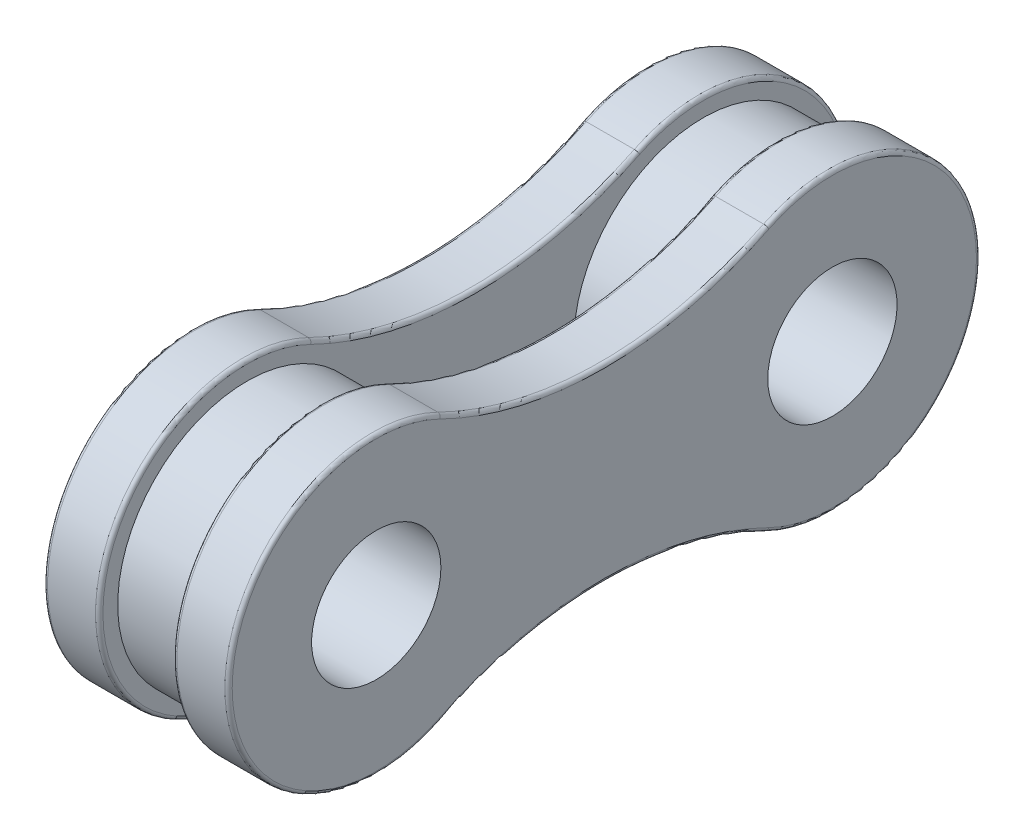
ISO-10303-21;
HEADER;
FILE_DESCRIPTION(('STEP AP214'),'2;1');
FILE_NAME('part.step','',(''),(''),'','','');
FILE_SCHEMA(('AUTOMOTIVE_DESIGN { 1 0 10303 214 1 1 1 1 }'));
ENDSEC;
DATA;
#1=APPLICATION_CONTEXT('core data for automotive mechanical design processes');
#2=APPLICATION_PROTOCOL_DEFINITION('international standard','automotive_design',2000,#1);
#3=PRODUCT_CONTEXT('',#1,'mechanical');
#4=PRODUCT('Part','Part','',(#3));
#5=PRODUCT_RELATED_PRODUCT_CATEGORY('part','',(#4));
#6=PRODUCT_DEFINITION_FORMATION('','',#4);
#7=PRODUCT_DEFINITION_CONTEXT('part definition',#1,'design');
#8=PRODUCT_DEFINITION('design','',#6,#7);
#9=PRODUCT_DEFINITION_SHAPE('','',#8);
#10=(LENGTH_UNIT() NAMED_UNIT(*) SI_UNIT(.MILLI.,.METRE.));
#11=(NAMED_UNIT(*) PLANE_ANGLE_UNIT() SI_UNIT($,.RADIAN.));
#12=(NAMED_UNIT(*) SI_UNIT($,.STERADIAN.) SOLID_ANGLE_UNIT());
#13=UNCERTAINTY_MEASURE_WITH_UNIT(LENGTH_MEASURE(1.E-05),#10,'distance_accuracy_value','');
#14=(GEOMETRIC_REPRESENTATION_CONTEXT(3) GLOBAL_UNCERTAINTY_ASSIGNED_CONTEXT((#13)) GLOBAL_UNIT_ASSIGNED_CONTEXT((#10,
#11,#12)) REPRESENTATION_CONTEXT('',''));
#15=CARTESIAN_POINT('',(0.,0.,0.));
#16=DIRECTION('',(0.,0.,1.));
#17=DIRECTION('',(1.,0.,0.));
#18=AXIS2_PLACEMENT_3D('',#15,#16,#17);
#19=CARTESIAN_POINT('',(1.,6.2823040160438,-3.0875));
#20=DIRECTION('',(1.,0.,0.));
#21=DIRECTION('',(0.,0.,-1.));
#22=AXIS2_PLACEMENT_3D('',#19,#20,#21);
#23=PLANE('',#22);
#24=CARTESIAN_POINT('',(1.,12.5646080320876,0.));
#25=DIRECTION('',(1.,0.,0.));
#26=DIRECTION('',(0.,0.,-1.));
#27=AXIS2_PLACEMENT_3D('',#24,#25,#26);
#28=CIRCLE('',#27,10.1);
#29=CARTESIAN_POINT('',(1.,3.50014080893869,4.45482142857143));
#30=VERTEX_POINT('',#29);
#31=CARTESIAN_POINT('',(1.,3.50014080893869,-4.45482142857143));
#32=VERTEX_POINT('',#31);
#33=EDGE_CURVE('E225',#30,#32,#28,.T.);
#34=ORIENTED_EDGE('',*,*,#33,.T.);
#35=CARTESIAN_POINT('',(1.,0.,-6.175));
#36=DIRECTION('',(1.,0.,0.));
#37=DIRECTION('',(0.,0.,-1.));
#38=AXIS2_PLACEMENT_3D('',#35,#36,#37);
#39=CIRCLE('',#38,3.9);
#40=CARTESIAN_POINT('',(1.,-3.50014080893868,-4.45482142857143));
#41=VERTEX_POINT('',#40);
#42=EDGE_CURVE('E231',#32,#41,#39,.F.);
#43=ORIENTED_EDGE('',*,*,#42,.T.);
#44=CARTESIAN_POINT('',(1.,-12.5646080320876,0.));
#45=DIRECTION('',(1.,0.,0.));
#46=DIRECTION('',(0.,0.,-1.));
#47=AXIS2_PLACEMENT_3D('',#44,#45,#46);
#48=CIRCLE('',#47,10.1);
#49=CARTESIAN_POINT('',(1.,-3.50014080893869,4.45482142857143));
#50=VERTEX_POINT('',#49);
#51=EDGE_CURVE('E229',#41,#50,#48,.T.);
#52=ORIENTED_EDGE('',*,*,#51,.T.);
#53=CARTESIAN_POINT('',(1.,0.,6.175));
#54=DIRECTION('',(1.,0.,0.));
#55=DIRECTION('',(0.,0.,-1.));
#56=AXIS2_PLACEMENT_3D('',#53,#54,#55);
#57=CIRCLE('',#56,3.9);
#58=EDGE_CURVE('E227',#50,#30,#57,.F.);
#59=ORIENTED_EDGE('',*,*,#58,.T.);
#60=EDGE_LOOP('',(#34,#43,#52,#59));
#61=FACE_BOUND('',#60,.T.);
#62=CARTESIAN_POINT('',(1.,0.,6.175));
#63=DIRECTION('',(1.,0.,0.));
#64=DIRECTION('',(0.,0.,-1.));
#65=AXIS2_PLACEMENT_3D('',#62,#63,#64);
#66=CIRCLE('',#65,3.5);
#67=CARTESIAN_POINT('',(1.,0.,2.675));
#68=VERTEX_POINT('',#67);
#69=EDGE_CURVE('E308',#68,#68,#66,.F.);
#70=ORIENTED_EDGE('',*,*,#69,.F.);
#71=EDGE_LOOP('',(#70));
#72=FACE_BOUND('',#71,.T.);
#73=CARTESIAN_POINT('',(1.,0.,-6.175));
#74=DIRECTION('',(1.,0.,0.));
#75=DIRECTION('',(0.,0.,-1.));
#76=AXIS2_PLACEMENT_3D('',#73,#74,#75);
#77=CIRCLE('',#76,3.5);
#78=CARTESIAN_POINT('',(1.,0.,-9.675));
#79=VERTEX_POINT('',#78);
#80=EDGE_CURVE('E198',#79,#79,#77,.F.);
#81=ORIENTED_EDGE('',*,*,#80,.F.);
#82=EDGE_LOOP('',(#81));
#83=FACE_BOUND('',#82,.T.);
#84=ADVANCED_FACE('F41',(#61,#72,#83),#23,.F.);
#85=CARTESIAN_POINT('',(-1.,-6.2823040160438,3.0875));
#86=DIRECTION('',(1.,0.,0.));
#87=DIRECTION('',(0.,0.,-1.));
#88=AXIS2_PLACEMENT_3D('',#85,#86,#87);
#89=PLANE('',#88);
#90=CARTESIAN_POINT('',(-1.,-12.5646080320876,0.));
#91=DIRECTION('',(1.,0.,0.));
#92=DIRECTION('',(0.,0.,-1.));
#93=AXIS2_PLACEMENT_3D('',#90,#91,#92);
#94=CIRCLE('',#93,10.1);
#95=CARTESIAN_POINT('',(-1.,-3.50014080893869,4.45482142857143));
#96=VERTEX_POINT('',#95);
#97=CARTESIAN_POINT('',(-1.,-3.50014080893868,-4.45482142857143));
#98=VERTEX_POINT('',#97);
#99=EDGE_CURVE('E214',#96,#98,#94,.F.);
#100=ORIENTED_EDGE('',*,*,#99,.T.);
#101=CARTESIAN_POINT('',(-1.,0.,-6.175));
#102=DIRECTION('',(1.,0.,0.));
#103=DIRECTION('',(0.,0.,-1.));
#104=AXIS2_PLACEMENT_3D('',#101,#102,#103);
#105=CIRCLE('',#104,3.9);
#106=CARTESIAN_POINT('',(-1.,3.50014080893868,-4.45482142857142));
#107=VERTEX_POINT('',#106);
#108=EDGE_CURVE('E216',#98,#107,#105,.T.);
#109=ORIENTED_EDGE('',*,*,#108,.T.);
#110=CARTESIAN_POINT('',(-1.,12.5646080320876,0.));
#111=DIRECTION('',(1.,0.,0.));
#112=DIRECTION('',(0.,0.,-1.));
#113=AXIS2_PLACEMENT_3D('',#110,#111,#112);
#114=CIRCLE('',#113,10.1);
#115=CARTESIAN_POINT('',(-1.,3.50014080893869,4.45482142857142));
#116=VERTEX_POINT('',#115);
#117=EDGE_CURVE('E210',#107,#116,#114,.F.);
#118=ORIENTED_EDGE('',*,*,#117,.T.);
#119=CARTESIAN_POINT('',(-1.,0.,6.175));
#120=DIRECTION('',(1.,0.,0.));
#121=DIRECTION('',(0.,0.,-1.));
#122=AXIS2_PLACEMENT_3D('',#119,#120,#121);
#123=CIRCLE('',#122,3.9);
#124=EDGE_CURVE('E212',#116,#96,#123,.T.);
#125=ORIENTED_EDGE('',*,*,#124,.T.);
#126=EDGE_LOOP('',(#100,#109,#118,#125));
#127=FACE_BOUND('',#126,.T.);
#128=CARTESIAN_POINT('',(-1.,0.,6.175));
#129=DIRECTION('',(1.,0.,0.));
#130=DIRECTION('',(0.,0.,-1.));
#131=AXIS2_PLACEMENT_3D('',#128,#129,#130);
#132=CIRCLE('',#131,3.5);
#133=CARTESIAN_POINT('',(-1.,0.,2.675));
#134=VERTEX_POINT('',#133);
#135=EDGE_CURVE('E559',#134,#134,#132,.T.);
#136=ORIENTED_EDGE('',*,*,#135,.F.);
#137=EDGE_LOOP('',(#136));
#138=FACE_BOUND('',#137,.T.);
#139=CARTESIAN_POINT('',(-1.,0.,-6.175));
#140=DIRECTION('',(1.,0.,0.));
#141=DIRECTION('',(0.,0.,-1.));
#142=AXIS2_PLACEMENT_3D('',#139,#140,#141);
#143=CIRCLE('',#142,3.5);
#144=CARTESIAN_POINT('',(-1.,0.,-9.675));
#145=VERTEX_POINT('',#144);
#146=EDGE_CURVE('E259',#145,#145,#143,.T.);
#147=ORIENTED_EDGE('',*,*,#146,.F.);
#148=EDGE_LOOP('',(#147));
#149=FACE_BOUND('',#148,.T.);
#150=ADVANCED_FACE('F322',(#127,#138,#149),#89,.T.);
#151=CARTESIAN_POINT('',(2.5,6.2823040160438,-3.0875));
#152=DIRECTION('',(1.,0.,0.));
#153=DIRECTION('',(0.,0.,-1.));
#154=AXIS2_PLACEMENT_3D('',#151,#152,#153);
#155=PLANE('',#154);
#156=CARTESIAN_POINT('',(2.5,-12.5646080320876,0.));
#157=DIRECTION('',(1.,0.,0.));
#158=DIRECTION('',(0.,0.,-1.));
#159=AXIS2_PLACEMENT_3D('',#156,#157,#158);
#160=CIRCLE('',#159,10.1);
#161=CARTESIAN_POINT('',(2.5,-3.50014080893869,4.45482142857143));
#162=VERTEX_POINT('',#161);
#163=CARTESIAN_POINT('',(2.5,-3.50014080893868,-4.45482142857143));
#164=VERTEX_POINT('',#163);
#165=EDGE_CURVE('E58',#162,#164,#160,.F.);
#166=ORIENTED_EDGE('',*,*,#165,.T.);
#167=CARTESIAN_POINT('',(2.5,0.,-6.175));
#168=DIRECTION('',(1.,0.,0.));
#169=DIRECTION('',(0.,0.,-1.));
#170=AXIS2_PLACEMENT_3D('',#167,#168,#169);
#171=CIRCLE('',#170,3.9);
#172=CARTESIAN_POINT('',(2.5,3.50014080893869,-4.45482142857143));
#173=VERTEX_POINT('',#172);
#174=EDGE_CURVE('E246',#164,#173,#171,.T.);
#175=ORIENTED_EDGE('',*,*,#174,.T.);
#176=CARTESIAN_POINT('',(2.5,12.5646080320876,0.));
#177=DIRECTION('',(1.,0.,0.));
#178=DIRECTION('',(0.,0.,-1.));
#179=AXIS2_PLACEMENT_3D('',#176,#177,#178);
#180=CIRCLE('',#179,10.1);
#181=CARTESIAN_POINT('',(2.5,3.50014080893869,4.45482142857143));
#182=VERTEX_POINT('',#181);
#183=EDGE_CURVE('E242',#173,#182,#180,.F.);
#184=ORIENTED_EDGE('',*,*,#183,.T.);
#185=CARTESIAN_POINT('',(2.5,0.,6.175));
#186=DIRECTION('',(1.,0.,0.));
#187=DIRECTION('',(0.,0.,-1.));
#188=AXIS2_PLACEMENT_3D('',#185,#186,#187);
#189=CIRCLE('',#188,3.9);
#190=EDGE_CURVE('E63',#182,#162,#189,.T.);
#191=ORIENTED_EDGE('',*,*,#190,.T.);
#192=EDGE_LOOP('',(#166,#175,#184,#191));
#193=FACE_BOUND('',#192,.T.);
#194=CARTESIAN_POINT('',(2.5,0.,6.175));
#195=DIRECTION('',(1.,0.,0.));
#196=DIRECTION('',(0.,0.,-1.));
#197=AXIS2_PLACEMENT_3D('',#194,#195,#196);
#198=CIRCLE('',#197,1.75);
#199=CARTESIAN_POINT('',(2.5,0.,4.425));
#200=VERTEX_POINT('',#199);
#201=EDGE_CURVE('E565',#200,#200,#198,.T.);
#202=ORIENTED_EDGE('',*,*,#201,.F.);
#203=EDGE_LOOP('',(#202));
#204=FACE_BOUND('',#203,.T.);
#205=CARTESIAN_POINT('',(2.5,0.,-6.175));
#206=DIRECTION('',(1.,0.,0.));
#207=DIRECTION('',(0.,0.,1.));
#208=AXIS2_PLACEMENT_3D('',#205,#206,#207);
#209=CIRCLE('',#208,1.75);
#210=CARTESIAN_POINT('',(2.5,0.,-4.425));
#211=VERTEX_POINT('',#210);
#212=EDGE_CURVE('E561',#211,#211,#209,.T.);
#213=ORIENTED_EDGE('',*,*,#212,.F.);
#214=EDGE_LOOP('',(#213));
#215=FACE_BOUND('',#214,.T.);
#216=ADVANCED_FACE('F329',(#193,#204,#215),#155,.T.);
#217=CARTESIAN_POINT('',(2.5,12.5646080320876,0.));
#218=DIRECTION('',(-1.,0.,0.));
#219=DIRECTION('',(0.,0.,1.));
#220=AXIS2_PLACEMENT_3D('',#217,#218,#219);
#221=CYLINDRICAL_SURFACE('',#220,10.);
#222=DIRECTION('',(-1.,0.,0.));
#223=VECTOR('',#222,1.);
#224=CARTESIAN_POINT('',(2.5,3.58988800916788,-4.41071428571429));
#225=LINE('',#224,#223);
#226=CARTESIAN_POINT('',(2.4,3.58988800916788,-4.41071428571429));
#227=VERTEX_POINT('',#226);
#228=CARTESIAN_POINT('',(1.1,3.58988800916788,-4.41071428571429));
#229=VERTEX_POINT('',#228);
#230=EDGE_CURVE('E573',#227,#229,#225,.T.);
#231=ORIENTED_EDGE('',*,*,#230,.T.);
#232=CARTESIAN_POINT('',(1.1,12.5646080320876,0.));
#233=DIRECTION('',(1.,0.,0.));
#234=DIRECTION('',(0.,0.,-1.));
#235=AXIS2_PLACEMENT_3D('',#232,#233,#234);
#236=CIRCLE('',#235,10.);
#237=CARTESIAN_POINT('',(1.1,3.58988800916788,4.41071428571429));
#238=VERTEX_POINT('',#237);
#239=EDGE_CURVE('E11',#229,#238,#236,.F.);
#240=ORIENTED_EDGE('',*,*,#239,.T.);
#241=DIRECTION('',(-1.,0.,0.));
#242=VECTOR('',#241,1.);
#243=CARTESIAN_POINT('',(2.5,3.58988800916788,4.41071428571429));
#244=LINE('',#243,#242);
#245=CARTESIAN_POINT('',(2.4,3.58988800916788,4.41071428571429));
#246=VERTEX_POINT('',#245);
#247=EDGE_CURVE('E299',#246,#238,#244,.T.);
#248=ORIENTED_EDGE('',*,*,#247,.F.);
#249=CARTESIAN_POINT('',(2.4,12.5646080320876,0.));
#250=DIRECTION('',(1.,0.,0.));
#251=DIRECTION('',(0.,0.,-1.));
#252=AXIS2_PLACEMENT_3D('',#249,#250,#251);
#253=CIRCLE('',#252,10.);
#254=EDGE_CURVE('E50',#246,#227,#253,.T.);
#255=ORIENTED_EDGE('',*,*,#254,.T.);
#256=EDGE_LOOP('',(#231,#240,#248,#255));
#257=FACE_BOUND('',#256,.T.);
#258=ADVANCED_FACE('F305',(#257),#221,.F.);
#259=CARTESIAN_POINT('',(2.5,0.,6.175));
#260=DIRECTION('',(-1.,0.,0.));
#261=DIRECTION('',(0.,0.,1.));
#262=AXIS2_PLACEMENT_3D('',#259,#260,#261);
#263=CYLINDRICAL_SURFACE('',#262,4.);
#264=ORIENTED_EDGE('',*,*,#247,.T.);
#265=CARTESIAN_POINT('',(1.1,0.,6.175));
#266=DIRECTION('',(1.,0.,0.));
#267=DIRECTION('',(0.,0.,-1.));
#268=AXIS2_PLACEMENT_3D('',#265,#266,#267);
#269=CIRCLE('',#268,4.);
#270=CARTESIAN_POINT('',(1.1,-3.58988800916788,4.41071428571429));
#271=VERTEX_POINT('',#270);
#272=EDGE_CURVE('E240',#238,#271,#269,.T.);
#273=ORIENTED_EDGE('',*,*,#272,.T.);
#274=DIRECTION('',(-1.,0.,0.));
#275=VECTOR('',#274,1.);
#276=CARTESIAN_POINT('',(2.5,-3.58988800916788,4.41071428571429));
#277=LINE('',#276,#275);
#278=CARTESIAN_POINT('',(2.4,-3.58988800916788,4.41071428571429));
#279=VERTEX_POINT('',#278);
#280=EDGE_CURVE('E302',#279,#271,#277,.T.);
#281=ORIENTED_EDGE('',*,*,#280,.F.);
#282=CARTESIAN_POINT('',(2.4,0.,6.175));
#283=DIRECTION('',(1.,0.,0.));
#284=DIRECTION('',(0.,0.,-1.));
#285=AXIS2_PLACEMENT_3D('',#282,#283,#284);
#286=CIRCLE('',#285,4.);
#287=EDGE_CURVE('E238',#279,#246,#286,.F.);
#288=ORIENTED_EDGE('',*,*,#287,.T.);
#289=EDGE_LOOP('',(#264,#273,#281,#288));
#290=FACE_BOUND('',#289,.T.);
#291=ADVANCED_FACE('F298',(#290),#263,.T.);
#292=CARTESIAN_POINT('',(2.5,-12.5646080320876,0.));
#293=DIRECTION('',(-1.,0.,0.));
#294=DIRECTION('',(0.,0.,1.));
#295=AXIS2_PLACEMENT_3D('',#292,#293,#294);
#296=CYLINDRICAL_SURFACE('',#295,10.);
#297=ORIENTED_EDGE('',*,*,#280,.T.);
#298=CARTESIAN_POINT('',(1.1,-12.5646080320876,0.));
#299=DIRECTION('',(1.,0.,0.));
#300=DIRECTION('',(0.,0.,-1.));
#301=AXIS2_PLACEMENT_3D('',#298,#299,#300);
#302=CIRCLE('',#301,10.);
#303=CARTESIAN_POINT('',(1.1,-3.58988800916788,-4.41071428571428));
#304=VERTEX_POINT('',#303);
#305=EDGE_CURVE('E236',#271,#304,#302,.F.);
#306=ORIENTED_EDGE('',*,*,#305,.T.);
#307=DIRECTION('',(-1.,0.,0.));
#308=VECTOR('',#307,1.);
#309=CARTESIAN_POINT('',(2.5,-3.58988800916788,-4.41071428571428));
#310=LINE('',#309,#308);
#311=CARTESIAN_POINT('',(2.4,-3.58988800916788,-4.41071428571428));
#312=VERTEX_POINT('',#311);
#313=EDGE_CURVE('E312',#312,#304,#310,.T.);
#314=ORIENTED_EDGE('',*,*,#313,.F.);
#315=CARTESIAN_POINT('',(2.4,-12.5646080320876,0.));
#316=DIRECTION('',(1.,0.,0.));
#317=DIRECTION('',(0.,0.,-1.));
#318=AXIS2_PLACEMENT_3D('',#315,#316,#317);
#319=CIRCLE('',#318,10.);
#320=EDGE_CURVE('E234',#312,#279,#319,.T.);
#321=ORIENTED_EDGE('',*,*,#320,.T.);
#322=EDGE_LOOP('',(#297,#306,#314,#321));
#323=FACE_BOUND('',#322,.T.);
#324=ADVANCED_FACE('F340',(#323),#296,.F.);
#325=CARTESIAN_POINT('',(2.5,0.,-6.175));
#326=DIRECTION('',(-1.,0.,0.));
#327=DIRECTION('',(0.,0.,1.));
#328=AXIS2_PLACEMENT_3D('',#325,#326,#327);
#329=CYLINDRICAL_SURFACE('',#328,4.);
#330=ORIENTED_EDGE('',*,*,#313,.T.);
#331=CARTESIAN_POINT('',(1.1,0.,-6.175));
#332=DIRECTION('',(1.,0.,0.));
#333=DIRECTION('',(0.,0.,-1.));
#334=AXIS2_PLACEMENT_3D('',#331,#332,#333);
#335=CIRCLE('',#334,4.);
#336=EDGE_CURVE('E222',#304,#229,#335,.T.);
#337=ORIENTED_EDGE('',*,*,#336,.T.);
#338=ORIENTED_EDGE('',*,*,#230,.F.);
#339=CARTESIAN_POINT('',(2.4,0.,-6.175));
#340=DIRECTION('',(1.,0.,0.));
#341=DIRECTION('',(0.,0.,-1.));
#342=AXIS2_PLACEMENT_3D('',#339,#340,#341);
#343=CIRCLE('',#342,4.);
#344=EDGE_CURVE('E219',#227,#312,#343,.F.);
#345=ORIENTED_EDGE('',*,*,#344,.T.);
#346=EDGE_LOOP('',(#330,#337,#338,#345));
#347=FACE_BOUND('',#346,.T.);
#348=ADVANCED_FACE('F336',(#347),#329,.T.);
#349=CARTESIAN_POINT('',(2.5,0.,6.175));
#350=DIRECTION('',(-1.,0.,0.));
#351=DIRECTION('',(0.,0.,1.));
#352=AXIS2_PLACEMENT_3D('',#349,#350,#351);
#353=CYLINDRICAL_SURFACE('',#352,1.75);
#354=ORIENTED_EDGE('',*,*,#201,.T.);
#355=EDGE_LOOP('',(#354));
#356=FACE_BOUND('',#355,.T.);
#357=CARTESIAN_POINT('',(-2.5,0.,6.175));
#358=DIRECTION('',(1.,0.,0.));
#359=DIRECTION('',(0.,0.,-1.));
#360=AXIS2_PLACEMENT_3D('',#357,#358,#359);
#361=CIRCLE('',#360,1.75);
#362=CARTESIAN_POINT('',(-2.5,0.,4.425));
#363=VERTEX_POINT('',#362);
#364=EDGE_CURVE('E598',#363,#363,#361,.T.);
#365=ORIENTED_EDGE('',*,*,#364,.F.);
#366=EDGE_LOOP('',(#365));
#367=FACE_BOUND('',#366,.T.);
#368=ADVANCED_FACE('F339',(#356,#367),#353,.F.);
#369=CARTESIAN_POINT('',(2.5,0.,-6.175));
#370=DIRECTION('',(-1.,0.,0.));
#371=DIRECTION('',(0.,0.,1.));
#372=AXIS2_PLACEMENT_3D('',#369,#370,#371);
#373=CYLINDRICAL_SURFACE('',#372,1.75);
#374=ORIENTED_EDGE('',*,*,#212,.T.);
#375=EDGE_LOOP('',(#374));
#376=FACE_BOUND('',#375,.T.);
#377=CARTESIAN_POINT('',(-2.5,0.,-6.175));
#378=DIRECTION('',(1.,0.,0.));
#379=DIRECTION('',(0.,0.,-1.));
#380=AXIS2_PLACEMENT_3D('',#377,#378,#379);
#381=CIRCLE('',#380,1.75);
#382=CARTESIAN_POINT('',(-2.5,0.,-7.925));
#383=VERTEX_POINT('',#382);
#384=EDGE_CURVE('E596',#383,#383,#381,.T.);
#385=ORIENTED_EDGE('',*,*,#384,.F.);
#386=EDGE_LOOP('',(#385));
#387=FACE_BOUND('',#386,.T.);
#388=ADVANCED_FACE('F527',(#376,#387),#373,.F.);
#389=CARTESIAN_POINT('',(1.,0.,6.175));
#390=DIRECTION('',(-1.,0.,0.));
#391=DIRECTION('',(0.,0.,1.));
#392=AXIS2_PLACEMENT_3D('',#389,#390,#391);
#393=CYLINDRICAL_SURFACE('',#392,3.5);
#394=ORIENTED_EDGE('',*,*,#69,.T.);
#395=EDGE_LOOP('',(#394));
#396=FACE_BOUND('',#395,.T.);
#397=ORIENTED_EDGE('',*,*,#135,.T.);
#398=EDGE_LOOP('',(#397));
#399=FACE_BOUND('',#398,.T.);
#400=ADVANCED_FACE('F489',(#396,#399),#393,.T.);
#401=CARTESIAN_POINT('',(-2.5,0.,6.175));
#402=DIRECTION('',(1.,0.,0.));
#403=DIRECTION('',(0.,0.,-1.));
#404=AXIS2_PLACEMENT_3D('',#401,#402,#403);
#405=CYLINDRICAL_SURFACE('',#404,4.);
#406=DIRECTION('',(1.,0.,0.));
#407=VECTOR('',#406,1.);
#408=CARTESIAN_POINT('',(-2.5,3.58988800916788,4.41071428571428));
#409=LINE('',#408,#407);
#410=CARTESIAN_POINT('',(-2.4,3.58988800916788,4.41071428571428));
#411=VERTEX_POINT('',#410);
#412=CARTESIAN_POINT('',(-1.1,3.58988800916788,4.41071428571428));
#413=VERTEX_POINT('',#412);
#414=EDGE_CURVE('E562',#411,#413,#409,.T.);
#415=ORIENTED_EDGE('',*,*,#414,.F.);
#416=CARTESIAN_POINT('',(-2.4,0.,6.175));
#417=DIRECTION('',(1.,0.,0.));
#418=DIRECTION('',(0.,0.,-1.));
#419=AXIS2_PLACEMENT_3D('',#416,#417,#418);
#420=CIRCLE('',#419,4.);
#421=CARTESIAN_POINT('',(-2.4,-3.58988800916788,4.41071428571429));
#422=VERTEX_POINT('',#421);
#423=EDGE_CURVE('E208',#411,#422,#420,.T.);
#424=ORIENTED_EDGE('',*,*,#423,.T.);
#425=DIRECTION('',(1.,0.,0.));
#426=VECTOR('',#425,1.);
#427=CARTESIAN_POINT('',(-2.5,-3.58988800916788,4.41071428571429));
#428=LINE('',#427,#426);
#429=CARTESIAN_POINT('',(-1.1,-3.58988800916788,4.41071428571429));
#430=VERTEX_POINT('',#429);
#431=EDGE_CURVE('E161',#422,#430,#428,.T.);
#432=ORIENTED_EDGE('',*,*,#431,.T.);
#433=CARTESIAN_POINT('',(-1.1,0.,6.175));
#434=DIRECTION('',(1.,0.,0.));
#435=DIRECTION('',(0.,0.,-1.));
#436=AXIS2_PLACEMENT_3D('',#433,#434,#435);
#437=CIRCLE('',#436,4.);
#438=EDGE_CURVE('E166',#430,#413,#437,.F.);
#439=ORIENTED_EDGE('',*,*,#438,.T.);
#440=EDGE_LOOP('',(#415,#424,#432,#439));
#441=FACE_BOUND('',#440,.T.);
#442=ADVANCED_FACE('F482',(#441),#405,.T.);
#443=CARTESIAN_POINT('',(-2.5,12.5646080320876,0.));
#444=DIRECTION('',(1.,0.,0.));
#445=DIRECTION('',(0.,0.,-1.));
#446=AXIS2_PLACEMENT_3D('',#443,#444,#445);
#447=CYLINDRICAL_SURFACE('',#446,10.);
#448=DIRECTION('',(1.,0.,0.));
#449=VECTOR('',#448,1.);
#450=CARTESIAN_POINT('',(-2.5,3.58988800916788,-4.41071428571428));
#451=LINE('',#450,#449);
#452=CARTESIAN_POINT('',(-2.4,3.58988800916788,-4.41071428571428));
#453=VERTEX_POINT('',#452);
#454=CARTESIAN_POINT('',(-1.1,3.58988800916788,-4.41071428571428));
#455=VERTEX_POINT('',#454);
#456=EDGE_CURVE('E179',#453,#455,#451,.T.);
#457=ORIENTED_EDGE('',*,*,#456,.F.);
#458=CARTESIAN_POINT('',(-2.4,12.5646080320876,0.));
#459=DIRECTION('',(1.,0.,0.));
#460=DIRECTION('',(0.,0.,-1.));
#461=AXIS2_PLACEMENT_3D('',#458,#459,#460);
#462=CIRCLE('',#461,10.);
#463=EDGE_CURVE('E250',#453,#411,#462,.F.);
#464=ORIENTED_EDGE('',*,*,#463,.T.);
#465=ORIENTED_EDGE('',*,*,#414,.T.);
#466=CARTESIAN_POINT('',(-1.1,12.5646080320876,0.));
#467=DIRECTION('',(1.,0.,0.));
#468=DIRECTION('',(0.,0.,-1.));
#469=AXIS2_PLACEMENT_3D('',#466,#467,#468);
#470=CIRCLE('',#469,10.);
#471=EDGE_CURVE('E248',#413,#455,#470,.T.);
#472=ORIENTED_EDGE('',*,*,#471,.T.);
#473=EDGE_LOOP('',(#457,#464,#465,#472));
#474=FACE_BOUND('',#473,.T.);
#475=ADVANCED_FACE('F475',(#474),#447,.F.);
#476=CARTESIAN_POINT('',(-2.5,0.,-6.175));
#477=DIRECTION('',(1.,0.,0.));
#478=DIRECTION('',(0.,0.,-1.));
#479=AXIS2_PLACEMENT_3D('',#476,#477,#478);
#480=CYLINDRICAL_SURFACE('',#479,4.);
#481=DIRECTION('',(1.,0.,0.));
#482=VECTOR('',#481,1.);
#483=CARTESIAN_POINT('',(-2.5,-3.58988800916788,-4.41071428571428));
#484=LINE('',#483,#482);
#485=CARTESIAN_POINT('',(-2.4,-3.58988800916788,-4.41071428571428));
#486=VERTEX_POINT('',#485);
#487=CARTESIAN_POINT('',(-1.1,-3.58988800916788,-4.41071428571428));
#488=VERTEX_POINT('',#487);
#489=EDGE_CURVE('E159',#486,#488,#484,.T.);
#490=ORIENTED_EDGE('',*,*,#489,.F.);
#491=CARTESIAN_POINT('',(-2.4,0.,-6.175));
#492=DIRECTION('',(1.,0.,0.));
#493=DIRECTION('',(0.,0.,-1.));
#494=AXIS2_PLACEMENT_3D('',#491,#492,#493);
#495=CIRCLE('',#494,4.);
#496=EDGE_CURVE('E175',#486,#453,#495,.T.);
#497=ORIENTED_EDGE('',*,*,#496,.T.);
#498=ORIENTED_EDGE('',*,*,#456,.T.);
#499=CARTESIAN_POINT('',(-1.1,0.,-6.175));
#500=DIRECTION('',(1.,0.,0.));
#501=DIRECTION('',(0.,0.,-1.));
#502=AXIS2_PLACEMENT_3D('',#499,#500,#501);
#503=CIRCLE('',#502,4.);
#504=EDGE_CURVE('E178',#455,#488,#503,.F.);
#505=ORIENTED_EDGE('',*,*,#504,.T.);
#506=EDGE_LOOP('',(#490,#497,#498,#505));
#507=FACE_BOUND('',#506,.T.);
#508=ADVANCED_FACE('F172',(#507),#480,.T.);
#509=CARTESIAN_POINT('',(-2.5,-12.5646080320876,0.));
#510=DIRECTION('',(1.,0.,0.));
#511=DIRECTION('',(0.,0.,-1.));
#512=AXIS2_PLACEMENT_3D('',#509,#510,#511);
#513=CYLINDRICAL_SURFACE('',#512,10.);
#514=ORIENTED_EDGE('',*,*,#431,.F.);
#515=CARTESIAN_POINT('',(-2.4,-12.5646080320876,0.));
#516=DIRECTION('',(1.,0.,0.));
#517=DIRECTION('',(0.,0.,-1.));
#518=AXIS2_PLACEMENT_3D('',#515,#516,#517);
#519=CIRCLE('',#518,10.);
#520=EDGE_CURVE('E156',#422,#486,#519,.F.);
#521=ORIENTED_EDGE('',*,*,#520,.T.);
#522=ORIENTED_EDGE('',*,*,#489,.T.);
#523=CARTESIAN_POINT('',(-1.1,-12.5646080320876,0.));
#524=DIRECTION('',(1.,0.,0.));
#525=DIRECTION('',(0.,0.,-1.));
#526=AXIS2_PLACEMENT_3D('',#523,#524,#525);
#527=CIRCLE('',#526,10.);
#528=EDGE_CURVE('E167',#488,#430,#527,.T.);
#529=ORIENTED_EDGE('',*,*,#528,.T.);
#530=EDGE_LOOP('',(#514,#521,#522,#529));
#531=FACE_BOUND('',#530,.T.);
#532=ADVANCED_FACE('F158',(#531),#513,.F.);
#533=CARTESIAN_POINT('',(-2.5,-6.2823040160438,3.0875));
#534=DIRECTION('',(1.,0.,0.));
#535=DIRECTION('',(0.,0.,-1.));
#536=AXIS2_PLACEMENT_3D('',#533,#534,#535);
#537=PLANE('',#536);
#538=CARTESIAN_POINT('',(-2.5,12.5646080320876,0.));
#539=DIRECTION('',(1.,0.,0.));
#540=DIRECTION('',(0.,0.,-1.));
#541=AXIS2_PLACEMENT_3D('',#538,#539,#540);
#542=CIRCLE('',#541,10.1);
#543=CARTESIAN_POINT('',(-2.5,3.50014080893869,4.45482142857142));
#544=VERTEX_POINT('',#543);
#545=CARTESIAN_POINT('',(-2.5,3.50014080893868,-4.45482142857142));
#546=VERTEX_POINT('',#545);
#547=EDGE_CURVE('E194',#544,#546,#542,.T.);
#548=ORIENTED_EDGE('',*,*,#547,.T.);
#549=CARTESIAN_POINT('',(-2.5,0.,-6.175));
#550=DIRECTION('',(1.,0.,0.));
#551=DIRECTION('',(0.,0.,-1.));
#552=AXIS2_PLACEMENT_3D('',#549,#550,#551);
#553=CIRCLE('',#552,3.9);
#554=CARTESIAN_POINT('',(-2.5,-3.50014080893868,-4.45482142857143));
#555=VERTEX_POINT('',#554);
#556=EDGE_CURVE('E204',#546,#555,#553,.F.);
#557=ORIENTED_EDGE('',*,*,#556,.T.);
#558=CARTESIAN_POINT('',(-2.5,-12.5646080320876,0.));
#559=DIRECTION('',(1.,0.,0.));
#560=DIRECTION('',(0.,0.,-1.));
#561=AXIS2_PLACEMENT_3D('',#558,#559,#560);
#562=CIRCLE('',#561,10.1);
#563=CARTESIAN_POINT('',(-2.5,-3.50014080893869,4.45482142857143));
#564=VERTEX_POINT('',#563);
#565=EDGE_CURVE('E184',#555,#564,#562,.T.);
#566=ORIENTED_EDGE('',*,*,#565,.T.);
#567=CARTESIAN_POINT('',(-2.5,0.,6.175));
#568=DIRECTION('',(1.,0.,0.));
#569=DIRECTION('',(0.,0.,-1.));
#570=AXIS2_PLACEMENT_3D('',#567,#568,#569);
#571=CIRCLE('',#570,3.9);
#572=EDGE_CURVE('E196',#564,#544,#571,.F.);
#573=ORIENTED_EDGE('',*,*,#572,.T.);
#574=EDGE_LOOP('',(#548,#557,#566,#573));
#575=FACE_BOUND('',#574,.T.);
#576=ORIENTED_EDGE('',*,*,#364,.T.);
#577=EDGE_LOOP('',(#576));
#578=FACE_BOUND('',#577,.T.);
#579=ORIENTED_EDGE('',*,*,#384,.T.);
#580=EDGE_LOOP('',(#579));
#581=FACE_BOUND('',#580,.T.);
#582=ADVANCED_FACE('F457',(#575,#578,#581),#537,.F.);
#583=CARTESIAN_POINT('',(1.,0.,-6.175));
#584=DIRECTION('',(-1.,0.,0.));
#585=DIRECTION('',(0.,0.,1.));
#586=AXIS2_PLACEMENT_3D('',#583,#584,#585);
#587=CYLINDRICAL_SURFACE('',#586,3.5);
#588=ORIENTED_EDGE('',*,*,#80,.T.);
#589=EDGE_LOOP('',(#588));
#590=FACE_BOUND('',#589,.T.);
#591=ORIENTED_EDGE('',*,*,#146,.T.);
#592=EDGE_LOOP('',(#591));
#593=FACE_BOUND('',#592,.T.);
#594=ADVANCED_FACE('F318',(#590,#593),#587,.T.);
#595=CARTESIAN_POINT('',(-2.4,0.,6.175));
#596=DIRECTION('',(1.,0.,0.));
#597=DIRECTION('',(0.,0.,-1.));
#598=AXIS2_PLACEMENT_3D('',#595,#596,#597);
#599=TOROIDAL_SURFACE('',#598,3.9,0.1);
#600=CARTESIAN_POINT('',(-2.4,3.50014080893868,4.45482142857143));
#601=DIRECTION('',(0.,-0.441071428571424,-0.897472002291973));
#602=DIRECTION('',(0.,0.897472002291973,-0.441071428571424));
#603=AXIS2_PLACEMENT_3D('',#600,#601,#602);
#604=CIRCLE('',#603,0.1);
#605=EDGE_CURVE('E188',#544,#411,#604,.T.);
#606=ORIENTED_EDGE('',*,*,#605,.F.);
#607=ORIENTED_EDGE('',*,*,#572,.F.);
#608=CARTESIAN_POINT('',(-2.4,-3.50014080893869,4.45482142857143));
#609=DIRECTION('',(0.,0.441071428571426,-0.897472002291972));
#610=DIRECTION('',(0.,0.897472002291972,0.441071428571426));
#611=AXIS2_PLACEMENT_3D('',#608,#609,#610);
#612=CIRCLE('',#611,0.1);
#613=EDGE_CURVE('E257',#422,#564,#612,.T.);
#614=ORIENTED_EDGE('',*,*,#613,.F.);
#615=ORIENTED_EDGE('',*,*,#423,.F.);
#616=EDGE_LOOP('',(#606,#607,#614,#615));
#617=FACE_BOUND('',#616,.T.);
#618=ADVANCED_FACE('F358',(#617),#599,.T.);
#619=CARTESIAN_POINT('',(-2.4,-12.5646080320876,0.));
#620=DIRECTION('',(1.,0.,0.));
#621=DIRECTION('',(0.,0.,-1.));
#622=AXIS2_PLACEMENT_3D('',#619,#620,#621);
#623=TOROIDAL_SURFACE('',#622,10.1,0.1);
#624=ORIENTED_EDGE('',*,*,#613,.T.);
#625=ORIENTED_EDGE('',*,*,#565,.F.);
#626=CARTESIAN_POINT('',(-2.4,-3.50014080893868,-4.45482142857143));
#627=DIRECTION('',(0.,-0.441071428571426,-0.897472002291972));
#628=DIRECTION('',(0.,0.897472002291972,-0.441071428571426));
#629=AXIS2_PLACEMENT_3D('',#626,#627,#628);
#630=CIRCLE('',#629,0.1);
#631=EDGE_CURVE('E182',#486,#555,#630,.T.);
#632=ORIENTED_EDGE('',*,*,#631,.F.);
#633=ORIENTED_EDGE('',*,*,#520,.F.);
#634=EDGE_LOOP('',(#624,#625,#632,#633));
#635=FACE_BOUND('',#634,.T.);
#636=ADVANCED_FACE('F183',(#635),#623,.T.);
#637=CARTESIAN_POINT('',(-2.4,12.5646080320876,0.));
#638=DIRECTION('',(1.,0.,0.));
#639=DIRECTION('',(0.,0.,-1.));
#640=AXIS2_PLACEMENT_3D('',#637,#638,#639);
#641=TOROIDAL_SURFACE('',#640,10.1,0.1);
#642=ORIENTED_EDGE('',*,*,#605,.T.);
#643=ORIENTED_EDGE('',*,*,#463,.F.);
#644=CARTESIAN_POINT('',(-2.4,3.50014080893868,-4.45482142857142));
#645=DIRECTION('',(0.,0.441071428571428,-0.897472002291971));
#646=DIRECTION('',(0.,0.897472002291971,0.441071428571428));
#647=AXIS2_PLACEMENT_3D('',#644,#645,#646);
#648=CIRCLE('',#647,0.1);
#649=EDGE_CURVE('E189',#546,#453,#648,.T.);
#650=ORIENTED_EDGE('',*,*,#649,.F.);
#651=ORIENTED_EDGE('',*,*,#547,.F.);
#652=EDGE_LOOP('',(#642,#643,#650,#651));
#653=FACE_BOUND('',#652,.T.);
#654=ADVANCED_FACE('F352',(#653),#641,.T.);
#655=CARTESIAN_POINT('',(-2.4,0.,-6.175));
#656=DIRECTION('',(1.,0.,0.));
#657=DIRECTION('',(0.,0.,-1.));
#658=AXIS2_PLACEMENT_3D('',#655,#656,#657);
#659=TOROIDAL_SURFACE('',#658,3.9,0.1);
#660=ORIENTED_EDGE('',*,*,#631,.T.);
#661=ORIENTED_EDGE('',*,*,#556,.F.);
#662=ORIENTED_EDGE('',*,*,#649,.T.);
#663=ORIENTED_EDGE('',*,*,#496,.F.);
#664=EDGE_LOOP('',(#660,#661,#662,#663));
#665=FACE_BOUND('',#664,.T.);
#666=ADVANCED_FACE('F191',(#665),#659,.T.);
#667=CARTESIAN_POINT('',(-1.1,0.,6.175));
#668=DIRECTION('',(1.,0.,0.));
#669=DIRECTION('',(0.,0.,-1.));
#670=AXIS2_PLACEMENT_3D('',#667,#668,#669);
#671=TOROIDAL_SURFACE('',#670,3.9,0.1);
#672=CARTESIAN_POINT('',(-1.1,3.50014080893868,4.45482142857143));
#673=DIRECTION('',(0.,-0.441071428571426,-0.897472002291972));
#674=DIRECTION('',(0.,0.897472002291972,-0.441071428571426));
#675=AXIS2_PLACEMENT_3D('',#672,#673,#674);
#676=CIRCLE('',#675,0.1);
#677=EDGE_CURVE('E265',#413,#116,#676,.T.);
#678=ORIENTED_EDGE('',*,*,#677,.F.);
#679=ORIENTED_EDGE('',*,*,#438,.F.);
#680=CARTESIAN_POINT('',(-1.1,-3.50014080893869,4.45482142857143));
#681=DIRECTION('',(0.,0.441071428571428,-0.897472002291971));
#682=DIRECTION('',(0.,0.897472002291971,0.441071428571428));
#683=AXIS2_PLACEMENT_3D('',#680,#681,#682);
#684=CIRCLE('',#683,0.1);
#685=EDGE_CURVE('E253',#96,#430,#684,.T.);
#686=ORIENTED_EDGE('',*,*,#685,.F.);
#687=ORIENTED_EDGE('',*,*,#124,.F.);
#688=EDGE_LOOP('',(#678,#679,#686,#687));
#689=FACE_BOUND('',#688,.T.);
#690=ADVANCED_FACE('F351',(#689),#671,.T.);
#691=CARTESIAN_POINT('',(-1.1,-12.5646080320876,0.));
#692=DIRECTION('',(1.,0.,0.));
#693=DIRECTION('',(0.,0.,-1.));
#694=AXIS2_PLACEMENT_3D('',#691,#692,#693);
#695=TOROIDAL_SURFACE('',#694,10.1,0.1);
#696=ORIENTED_EDGE('',*,*,#685,.T.);
#697=ORIENTED_EDGE('',*,*,#528,.F.);
#698=CARTESIAN_POINT('',(-1.1,-3.50014080893868,-4.45482142857143));
#699=DIRECTION('',(0.,-0.441071428571428,-0.897472002291971));
#700=DIRECTION('',(0.,0.897472002291971,-0.441071428571428));
#701=AXIS2_PLACEMENT_3D('',#698,#699,#700);
#702=CIRCLE('',#701,0.1);
#703=EDGE_CURVE('E262',#98,#488,#702,.T.);
#704=ORIENTED_EDGE('',*,*,#703,.F.);
#705=ORIENTED_EDGE('',*,*,#99,.F.);
#706=EDGE_LOOP('',(#696,#697,#704,#705));
#707=FACE_BOUND('',#706,.T.);
#708=ADVANCED_FACE('F370',(#707),#695,.T.);
#709=CARTESIAN_POINT('',(-1.1,12.5646080320876,0.));
#710=DIRECTION('',(1.,0.,0.));
#711=DIRECTION('',(0.,0.,-1.));
#712=AXIS2_PLACEMENT_3D('',#709,#710,#711);
#713=TOROIDAL_SURFACE('',#712,10.1,0.1);
#714=ORIENTED_EDGE('',*,*,#677,.T.);
#715=ORIENTED_EDGE('',*,*,#117,.F.);
#716=CARTESIAN_POINT('',(-1.1,3.50014080893868,-4.45482142857142));
#717=DIRECTION('',(0.,0.441071428571426,-0.897472002291972));
#718=DIRECTION('',(0.,0.897472002291972,0.441071428571426));
#719=AXIS2_PLACEMENT_3D('',#716,#717,#718);
#720=CIRCLE('',#719,0.1);
#721=EDGE_CURVE('E260',#455,#107,#720,.T.);
#722=ORIENTED_EDGE('',*,*,#721,.F.);
#723=ORIENTED_EDGE('',*,*,#471,.F.);
#724=EDGE_LOOP('',(#714,#715,#722,#723));
#725=FACE_BOUND('',#724,.T.);
#726=ADVANCED_FACE('F366',(#725),#713,.T.);
#727=CARTESIAN_POINT('',(-1.1,0.,-6.175));
#728=DIRECTION('',(1.,0.,0.));
#729=DIRECTION('',(0.,0.,-1.));
#730=AXIS2_PLACEMENT_3D('',#727,#728,#729);
#731=TOROIDAL_SURFACE('',#730,3.9,0.1);
#732=ORIENTED_EDGE('',*,*,#703,.T.);
#733=ORIENTED_EDGE('',*,*,#504,.F.);
#734=ORIENTED_EDGE('',*,*,#721,.T.);
#735=ORIENTED_EDGE('',*,*,#108,.F.);
#736=EDGE_LOOP('',(#732,#733,#734,#735));
#737=FACE_BOUND('',#736,.T.);
#738=ADVANCED_FACE('F362',(#737),#731,.T.);
#739=CARTESIAN_POINT('',(1.1,0.,6.175));
#740=DIRECTION('',(1.,0.,0.));
#741=DIRECTION('',(0.,0.,-1.));
#742=AXIS2_PLACEMENT_3D('',#739,#740,#741);
#743=TOROIDAL_SURFACE('',#742,3.9,0.1);
#744=CARTESIAN_POINT('',(1.1,3.50014080893869,4.45482142857143));
#745=DIRECTION('',(0.,-0.441071428571426,-0.897472002291972));
#746=DIRECTION('',(0.,0.897472002291972,-0.441071428571426));
#747=AXIS2_PLACEMENT_3D('',#744,#745,#746);
#748=CIRCLE('',#747,0.1);
#749=EDGE_CURVE('E274',#30,#238,#748,.T.);
#750=ORIENTED_EDGE('',*,*,#749,.F.);
#751=ORIENTED_EDGE('',*,*,#58,.F.);
#752=CARTESIAN_POINT('',(1.1,-3.50014080893869,4.45482142857143));
#753=DIRECTION('',(0.,0.441071428571426,-0.897472002291972));
#754=DIRECTION('',(0.,0.897472002291972,0.441071428571426));
#755=AXIS2_PLACEMENT_3D('',#752,#753,#754);
#756=CIRCLE('',#755,0.1);
#757=EDGE_CURVE('E263',#271,#50,#756,.T.);
#758=ORIENTED_EDGE('',*,*,#757,.F.);
#759=ORIENTED_EDGE('',*,*,#272,.F.);
#760=EDGE_LOOP('',(#750,#751,#758,#759));
#761=FACE_BOUND('',#760,.T.);
#762=ADVANCED_FACE('F365',(#761),#743,.T.);
#763=CARTESIAN_POINT('',(1.1,-12.5646080320876,0.));
#764=DIRECTION('',(1.,0.,0.));
#765=DIRECTION('',(0.,0.,-1.));
#766=AXIS2_PLACEMENT_3D('',#763,#764,#765);
#767=TOROIDAL_SURFACE('',#766,10.1,0.1);
#768=ORIENTED_EDGE('',*,*,#757,.T.);
#769=ORIENTED_EDGE('',*,*,#51,.F.);
#770=CARTESIAN_POINT('',(1.1,-3.50014080893869,-4.45482142857143));
#771=DIRECTION('',(0.,-0.441071428571426,-0.897472002291972));
#772=DIRECTION('',(0.,0.897472002291972,-0.441071428571426));
#773=AXIS2_PLACEMENT_3D('',#770,#771,#772);
#774=CIRCLE('',#773,0.1);
#775=EDGE_CURVE('E272',#304,#41,#774,.T.);
#776=ORIENTED_EDGE('',*,*,#775,.F.);
#777=ORIENTED_EDGE('',*,*,#305,.F.);
#778=EDGE_LOOP('',(#768,#769,#776,#777));
#779=FACE_BOUND('',#778,.T.);
#780=ADVANCED_FACE('F385',(#779),#767,.T.);
#781=CARTESIAN_POINT('',(1.1,12.5646080320876,0.));
#782=DIRECTION('',(1.,0.,0.));
#783=DIRECTION('',(0.,0.,-1.));
#784=AXIS2_PLACEMENT_3D('',#781,#782,#783);
#785=TOROIDAL_SURFACE('',#784,10.1,0.1);
#786=ORIENTED_EDGE('',*,*,#749,.T.);
#787=ORIENTED_EDGE('',*,*,#239,.F.);
#788=CARTESIAN_POINT('',(1.1,3.50014080893869,-4.45482142857143));
#789=DIRECTION('',(0.,0.441071428571426,-0.897472002291972));
#790=DIRECTION('',(0.,0.897472002291972,0.441071428571426));
#791=AXIS2_PLACEMENT_3D('',#788,#789,#790);
#792=CIRCLE('',#791,0.1);
#793=EDGE_CURVE('E270',#32,#229,#792,.T.);
#794=ORIENTED_EDGE('',*,*,#793,.F.);
#795=ORIENTED_EDGE('',*,*,#33,.F.);
#796=EDGE_LOOP('',(#786,#787,#794,#795));
#797=FACE_BOUND('',#796,.T.);
#798=ADVANCED_FACE('F381',(#797),#785,.T.);
#799=CARTESIAN_POINT('',(1.1,0.,-6.175));
#800=DIRECTION('',(1.,0.,0.));
#801=DIRECTION('',(0.,0.,-1.));
#802=AXIS2_PLACEMENT_3D('',#799,#800,#801);
#803=TOROIDAL_SURFACE('',#802,3.9,0.1);
#804=ORIENTED_EDGE('',*,*,#775,.T.);
#805=ORIENTED_EDGE('',*,*,#42,.F.);
#806=ORIENTED_EDGE('',*,*,#793,.T.);
#807=ORIENTED_EDGE('',*,*,#336,.F.);
#808=EDGE_LOOP('',(#804,#805,#806,#807));
#809=FACE_BOUND('',#808,.T.);
#810=ADVANCED_FACE('F378',(#809),#803,.T.);
#811=CARTESIAN_POINT('',(2.4,0.,6.175));
#812=DIRECTION('',(1.,0.,0.));
#813=DIRECTION('',(0.,0.,-1.));
#814=AXIS2_PLACEMENT_3D('',#811,#812,#813);
#815=TOROIDAL_SURFACE('',#814,3.9,0.1);
#816=CARTESIAN_POINT('',(2.4,3.50014080893869,4.45482142857143));
#817=DIRECTION('',(0.,-0.441071428571426,-0.897472002291972));
#818=DIRECTION('',(0.,0.897472002291972,-0.441071428571426));
#819=AXIS2_PLACEMENT_3D('',#816,#817,#818);
#820=CIRCLE('',#819,0.1);
#821=EDGE_CURVE('E282',#246,#182,#820,.T.);
#822=ORIENTED_EDGE('',*,*,#821,.F.);
#823=ORIENTED_EDGE('',*,*,#287,.F.);
#824=CARTESIAN_POINT('',(2.4,-3.50014080893869,4.45482142857143));
#825=DIRECTION('',(0.,0.441071428571426,-0.897472002291972));
#826=DIRECTION('',(0.,0.897472002291972,0.441071428571426));
#827=AXIS2_PLACEMENT_3D('',#824,#825,#826);
#828=CIRCLE('',#827,0.1);
#829=EDGE_CURVE('E45',#162,#279,#828,.T.);
#830=ORIENTED_EDGE('',*,*,#829,.F.);
#831=ORIENTED_EDGE('',*,*,#190,.F.);
#832=EDGE_LOOP('',(#822,#823,#830,#831));
#833=FACE_BOUND('',#832,.T.);
#834=ADVANCED_FACE('F43',(#833),#815,.T.);
#835=CARTESIAN_POINT('',(2.4,-12.5646080320876,0.));
#836=DIRECTION('',(1.,0.,0.));
#837=DIRECTION('',(0.,0.,-1.));
#838=AXIS2_PLACEMENT_3D('',#835,#836,#837);
#839=TOROIDAL_SURFACE('',#838,10.1,0.1);
#840=ORIENTED_EDGE('',*,*,#829,.T.);
#841=ORIENTED_EDGE('',*,*,#320,.F.);
#842=CARTESIAN_POINT('',(2.4,-3.50014080893868,-4.45482142857143));
#843=DIRECTION('',(0.,-0.44107142857143,-0.89747200229197));
#844=DIRECTION('',(0.,0.89747200229197,-0.44107142857143));
#845=AXIS2_PLACEMENT_3D('',#842,#843,#844);
#846=CIRCLE('',#845,0.1);
#847=EDGE_CURVE('E281',#164,#312,#846,.T.);
#848=ORIENTED_EDGE('',*,*,#847,.F.);
#849=ORIENTED_EDGE('',*,*,#165,.F.);
#850=EDGE_LOOP('',(#840,#841,#848,#849));
#851=FACE_BOUND('',#850,.T.);
#852=ADVANCED_FACE('F291',(#851),#839,.T.);
#853=CARTESIAN_POINT('',(2.4,12.5646080320876,0.));
#854=DIRECTION('',(1.,0.,0.));
#855=DIRECTION('',(0.,0.,-1.));
#856=AXIS2_PLACEMENT_3D('',#853,#854,#855);
#857=TOROIDAL_SURFACE('',#856,10.1,0.1);
#858=ORIENTED_EDGE('',*,*,#821,.T.);
#859=ORIENTED_EDGE('',*,*,#183,.F.);
#860=CARTESIAN_POINT('',(2.4,3.50014080893869,-4.45482142857143));
#861=DIRECTION('',(0.,0.441071428571426,-0.897472002291972));
#862=DIRECTION('',(0.,0.897472002291972,0.441071428571426));
#863=AXIS2_PLACEMENT_3D('',#860,#861,#862);
#864=CIRCLE('',#863,0.1);
#865=EDGE_CURVE('E279',#227,#173,#864,.T.);
#866=ORIENTED_EDGE('',*,*,#865,.F.);
#867=ORIENTED_EDGE('',*,*,#254,.F.);
#868=EDGE_LOOP('',(#858,#859,#866,#867));
#869=FACE_BOUND('',#868,.T.);
#870=ADVANCED_FACE('F396',(#869),#857,.T.);
#871=CARTESIAN_POINT('',(2.4,0.,-6.175));
#872=DIRECTION('',(1.,0.,0.));
#873=DIRECTION('',(0.,0.,-1.));
#874=AXIS2_PLACEMENT_3D('',#871,#872,#873);
#875=TOROIDAL_SURFACE('',#874,3.9,0.1);
#876=ORIENTED_EDGE('',*,*,#847,.T.);
#877=ORIENTED_EDGE('',*,*,#344,.F.);
#878=ORIENTED_EDGE('',*,*,#865,.T.);
#879=ORIENTED_EDGE('',*,*,#174,.F.);
#880=EDGE_LOOP('',(#876,#877,#878,#879));
#881=FACE_BOUND('',#880,.T.);
#882=ADVANCED_FACE('F393',(#881),#875,.T.);
#883=CLOSED_SHELL('',(#84,#150,#216,#258,#291,#324,#348,#368,#388,#400,#442,#475,#508,#532,#582,
#594,#618,#636,#654,#666,#690,#708,#726,#738,#762,#780,#798,#810,#834,#852,#870,#882));
#884=MANIFOLD_SOLID_BREP('B2',#883);
#885=ADVANCED_BREP_SHAPE_REPRESENTATION('',(#18,#884),#14);
#886=SHAPE_DEFINITION_REPRESENTATION(#9,#885);
ENDSEC;
END-ISO-10303-21;
